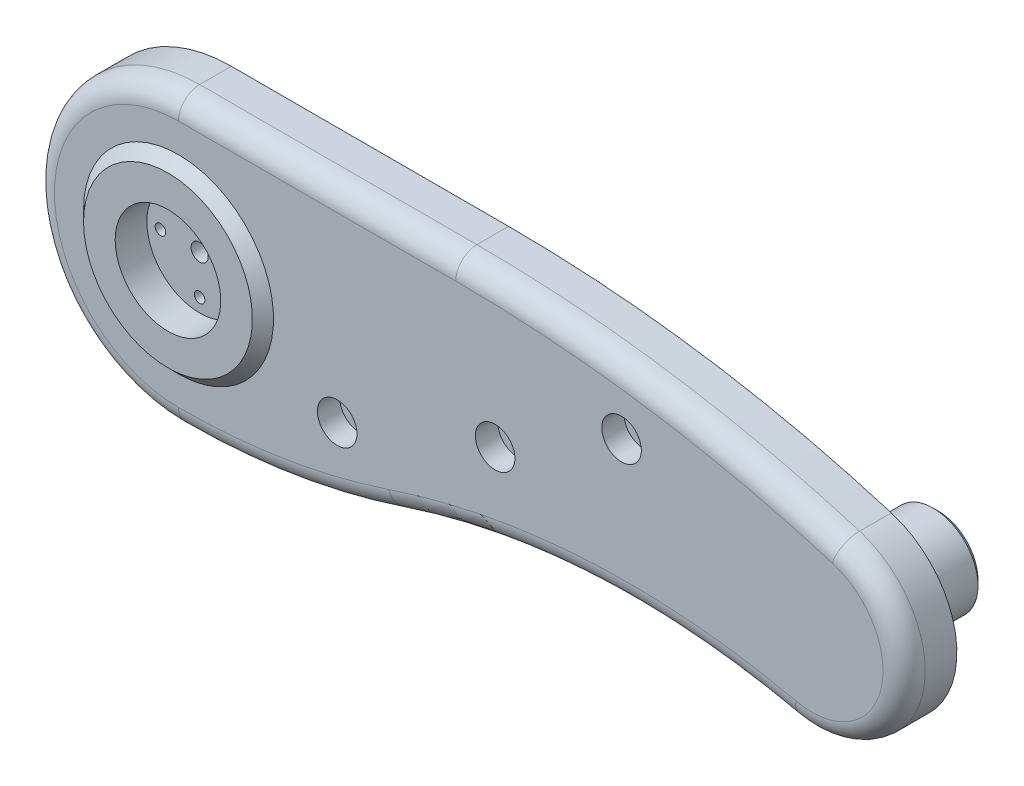
ISO-10303-21;
HEADER;
FILE_DESCRIPTION(('STEP AP214'),'2;1');
FILE_NAME('part.step','',(''),(''),'','','');
FILE_SCHEMA(('AUTOMOTIVE_DESIGN { 1 0 10303 214 1 1 1 1 }'));
ENDSEC;
DATA;
#1=APPLICATION_CONTEXT('core data for automotive mechanical design processes');
#2=APPLICATION_PROTOCOL_DEFINITION('international standard','automotive_design',2000,#1);
#3=PRODUCT_CONTEXT('',#1,'mechanical');
#4=PRODUCT('Part','Part','',(#3));
#5=PRODUCT_RELATED_PRODUCT_CATEGORY('part','',(#4));
#6=PRODUCT_DEFINITION_FORMATION('','',#4);
#7=PRODUCT_DEFINITION_CONTEXT('part definition',#1,'design');
#8=PRODUCT_DEFINITION('design','',#6,#7);
#9=PRODUCT_DEFINITION_SHAPE('','',#8);
#10=(LENGTH_UNIT() NAMED_UNIT(*) SI_UNIT(.MILLI.,.METRE.));
#11=(NAMED_UNIT(*) PLANE_ANGLE_UNIT() SI_UNIT($,.RADIAN.));
#12=(NAMED_UNIT(*) SI_UNIT($,.STERADIAN.) SOLID_ANGLE_UNIT());
#13=UNCERTAINTY_MEASURE_WITH_UNIT(LENGTH_MEASURE(1.E-05),#10,'distance_accuracy_value','');
#14=(GEOMETRIC_REPRESENTATION_CONTEXT(3) GLOBAL_UNCERTAINTY_ASSIGNED_CONTEXT((#13)) GLOBAL_UNIT_ASSIGNED_CONTEXT((#10,
#11,#12)) REPRESENTATION_CONTEXT('',''));
#15=CARTESIAN_POINT('',(0.,0.,0.));
#16=DIRECTION('',(0.,0.,1.));
#17=DIRECTION('',(1.,0.,0.));
#18=AXIS2_PLACEMENT_3D('',#15,#16,#17);
#19=CARTESIAN_POINT('',(0.,0.,4.));
#20=DIRECTION('',(0.,0.,1.));
#21=DIRECTION('',(-1.,0.,0.));
#22=AXIS2_PLACEMENT_3D('',#19,#20,#21);
#23=PLANE('',#22);
#24=CARTESIAN_POINT('',(0.,0.,4.));
#25=DIRECTION('',(0.,0.,-1.));
#26=DIRECTION('',(-1.,0.,0.));
#27=AXIS2_PLACEMENT_3D('',#24,#25,#26);
#28=CIRCLE('',#27,18.);
#29=CARTESIAN_POINT('',(-18.,0.,4.));
#30=VERTEX_POINT('',#29);
#31=EDGE_CURVE('E51',#30,#30,#28,.F.);
#32=ORIENTED_EDGE('',*,*,#31,.F.);
#33=EDGE_LOOP('',(#32));
#34=FACE_BOUND('',#33,.T.);
#35=CARTESIAN_POINT('',(30.0701638651491,-10.9446445864214,4.));
#36=DIRECTION('',(0.,0.,-1.));
#37=DIRECTION('',(-1.,0.,0.));
#38=AXIS2_PLACEMENT_3D('',#35,#36,#37);
#39=CIRCLE('',#38,3.75);
#40=CARTESIAN_POINT('',(26.3201638651491,-10.9446445864214,4.));
#41=VERTEX_POINT('',#40);
#42=EDGE_CURVE('E250',#41,#41,#39,.T.);
#43=ORIENTED_EDGE('',*,*,#42,.T.);
#44=EDGE_LOOP('',(#43));
#45=FACE_BOUND('',#44,.T.);
#46=CARTESIAN_POINT('',(60.,0.,4.));
#47=DIRECTION('',(0.,0.,-1.));
#48=DIRECTION('',(-1.,0.,0.));
#49=AXIS2_PLACEMENT_3D('',#46,#47,#48);
#50=CIRCLE('',#49,3.75000000000001);
#51=CARTESIAN_POINT('',(56.25,0.,4.));
#52=VERTEX_POINT('',#51);
#53=EDGE_CURVE('E254',#52,#52,#50,.T.);
#54=ORIENTED_EDGE('',*,*,#53,.T.);
#55=EDGE_LOOP('',(#54));
#56=FACE_BOUND('',#55,.T.);
#57=CARTESIAN_POINT('',(83.9535089505867,13.2969295284196,4.));
#58=DIRECTION('',(0.,0.,-1.));
#59=DIRECTION('',(-1.,0.,0.));
#60=AXIS2_PLACEMENT_3D('',#57,#58,#59);
#61=CIRCLE('',#60,3.75000000000001);
#62=CARTESIAN_POINT('',(80.2035089505867,13.2969295284196,4.));
#63=VERTEX_POINT('',#62);
#64=EDGE_CURVE('E258',#63,#63,#61,.T.);
#65=ORIENTED_EDGE('',*,*,#64,.T.);
#66=EDGE_LOOP('',(#65));
#67=FACE_BOUND('',#66,.T.);
#68=CARTESIAN_POINT('',(0.,102.5,4.));
#69=DIRECTION('',(0.,0.,-1.));
#70=DIRECTION('',(-1.,0.,0.));
#71=AXIS2_PLACEMENT_3D('',#68,#69,#70);
#72=CIRCLE('',#71,126.);
#73=CARTESIAN_POINT('',(39.8414913927188,-17.0351645483617,4.));
#74=VERTEX_POINT('',#73);
#75=CARTESIAN_POINT('',(0.,-23.5,4.));
#76=VERTEX_POINT('',#75);
#77=EDGE_CURVE('E190',#74,#76,#72,.T.);
#78=ORIENTED_EDGE('',*,*,#77,.F.);
#79=CARTESIAN_POINT('',(85.3746244129688,-153.646781175061,4.));
#80=DIRECTION('',(0.,0.,-1.));
#81=DIRECTION('',(-1.,0.,0.));
#82=AXIS2_PLACEMENT_3D('',#79,#80,#81);
#83=CIRCLE('',#82,144.);
#84=CARTESIAN_POINT('',(117.032110663969,-13.1697241007195,4.));
#85=VERTEX_POINT('',#84);
#86=EDGE_CURVE('E187',#85,#74,#83,.F.);
#87=ORIENTED_EDGE('',*,*,#86,.F.);
#88=CARTESIAN_POINT('',(120.,0.,4.));
#89=DIRECTION('',(0.,0.,-1.));
#90=DIRECTION('',(-1.,0.,0.));
#91=AXIS2_PLACEMENT_3D('',#88,#89,#90);
#92=CIRCLE('',#91,13.5);
#93=CARTESIAN_POINT('',(123.916665744164,12.9193548387097,4.));
#94=VERTEX_POINT('',#93);
#95=EDGE_CURVE('E184',#94,#85,#92,.T.);
#96=ORIENTED_EDGE('',*,*,#95,.F.);
#97=CARTESIAN_POINT('',(52.5463121838399,-222.5,4.));
#98=DIRECTION('',(0.,0.,-1.));
#99=DIRECTION('',(-1.,0.,0.));
#100=AXIS2_PLACEMENT_3D('',#97,#98,#99);
#101=CIRCLE('',#100,246.);
#102=CARTESIAN_POINT('',(52.5463121838399,23.5,4.));
#103=VERTEX_POINT('',#102);
#104=EDGE_CURVE('E182',#103,#94,#101,.T.);
#105=ORIENTED_EDGE('',*,*,#104,.F.);
#106=DIRECTION('',(1.,0.,0.));
#107=VECTOR('',#106,1.);
#108=CARTESIAN_POINT('',(0.,23.5,4.));
#109=LINE('',#108,#107);
#110=CARTESIAN_POINT('',(0.,23.5,4.));
#111=VERTEX_POINT('',#110);
#112=EDGE_CURVE('E127',#111,#103,#109,.T.);
#113=ORIENTED_EDGE('',*,*,#112,.F.);
#114=CARTESIAN_POINT('',(0.,0.,4.));
#115=DIRECTION('',(0.,0.,-1.));
#116=DIRECTION('',(-1.,0.,0.));
#117=AXIS2_PLACEMENT_3D('',#114,#115,#116);
#118=CIRCLE('',#117,23.5);
#119=EDGE_CURVE('E193',#76,#111,#118,.T.);
#120=ORIENTED_EDGE('',*,*,#119,.F.);
#121=EDGE_LOOP('',(#78,#87,#96,#105,#113,#120));
#122=FACE_BOUND('',#121,.T.);
#123=ADVANCED_FACE('F43',(#34,#45,#56,#67,#122),#23,.T.);
#124=CARTESIAN_POINT('',(0.,0.,-20.));
#125=DIRECTION('',(0.,0.,1.));
#126=DIRECTION('',(-1.,0.,0.));
#127=AXIS2_PLACEMENT_3D('',#124,#125,#126);
#128=CYLINDRICAL_SURFACE('',#127,1.625);
#129=CARTESIAN_POINT('',(0.,0.,0.));
#130=DIRECTION('',(0.,0.,-1.));
#131=DIRECTION('',(-1.,0.,0.));
#132=AXIS2_PLACEMENT_3D('',#129,#130,#131);
#133=CIRCLE('',#132,1.625);
#134=CARTESIAN_POINT('',(-1.625,0.,0.));
#135=VERTEX_POINT('',#134);
#136=EDGE_CURVE('E236',#135,#135,#133,.T.);
#137=ORIENTED_EDGE('',*,*,#136,.F.);
#138=EDGE_LOOP('',(#137));
#139=FACE_BOUND('',#138,.T.);
#140=CARTESIAN_POINT('',(0.,0.,-3.));
#141=DIRECTION('',(0.,0.,1.));
#142=DIRECTION('',(1.,0.,0.));
#143=AXIS2_PLACEMENT_3D('',#140,#141,#142);
#144=CIRCLE('',#143,1.625);
#145=CARTESIAN_POINT('',(1.625,0.,-3.));
#146=VERTEX_POINT('',#145);
#147=EDGE_CURVE('E234',#146,#146,#144,.F.);
#148=ORIENTED_EDGE('',*,*,#147,.T.);
#149=EDGE_LOOP('',(#148));
#150=FACE_BOUND('',#149,.T.);
#151=ADVANCED_FACE('F245',(#139,#150),#128,.F.);
#152=CARTESIAN_POINT('',(0.,0.,-6.));
#153=DIRECTION('',(0.,0.,-1.));
#154=DIRECTION('',(1.,0.,0.));
#155=AXIS2_PLACEMENT_3D('',#152,#153,#154);
#156=PLANE('',#155);
#157=CARTESIAN_POINT('',(0.,0.,-6.));
#158=DIRECTION('',(0.,0.,1.));
#159=DIRECTION('',(1.,0.,0.));
#160=AXIS2_PLACEMENT_3D('',#157,#158,#159);
#161=CIRCLE('',#160,9.5);
#162=CARTESIAN_POINT('',(9.5,0.,-6.));
#163=VERTEX_POINT('',#162);
#164=EDGE_CURVE('E377',#163,#163,#161,.T.);
#165=ORIENTED_EDGE('',*,*,#164,.T.);
#166=EDGE_LOOP('',(#165));
#167=FACE_BOUND('',#166,.T.);
#168=CARTESIAN_POINT('',(83.9535089505867,13.2969295284196,-6.));
#169=DIRECTION('',(0.,0.,1.));
#170=DIRECTION('',(1.,0.,0.));
#171=AXIS2_PLACEMENT_3D('',#168,#169,#170);
#172=CIRCLE('',#171,2.125);
#173=CARTESIAN_POINT('',(86.0785089505867,13.2969295284196,-6.));
#174=VERTEX_POINT('',#173);
#175=EDGE_CURVE('E147',#174,#174,#172,.T.);
#176=ORIENTED_EDGE('',*,*,#175,.T.);
#177=EDGE_LOOP('',(#176));
#178=FACE_BOUND('',#177,.T.);
#179=CARTESIAN_POINT('',(60.,0.,-6.));
#180=DIRECTION('',(0.,0.,1.));
#181=DIRECTION('',(1.,0.,0.));
#182=AXIS2_PLACEMENT_3D('',#179,#180,#181);
#183=CIRCLE('',#182,2.125);
#184=CARTESIAN_POINT('',(62.125,0.,-6.));
#185=VERTEX_POINT('',#184);
#186=EDGE_CURVE('E384',#185,#185,#183,.T.);
#187=ORIENTED_EDGE('',*,*,#186,.T.);
#188=EDGE_LOOP('',(#187));
#189=FACE_BOUND('',#188,.T.);
#190=CARTESIAN_POINT('',(30.0701638651491,-10.9446445864214,-6.));
#191=DIRECTION('',(0.,0.,1.));
#192=DIRECTION('',(1.,0.,0.));
#193=AXIS2_PLACEMENT_3D('',#190,#191,#192);
#194=CIRCLE('',#193,2.125);
#195=CARTESIAN_POINT('',(32.1951638651491,-10.9446445864214,-6.));
#196=VERTEX_POINT('',#195);
#197=EDGE_CURVE('E180',#196,#196,#194,.T.);
#198=ORIENTED_EDGE('',*,*,#197,.T.);
#199=EDGE_LOOP('',(#198));
#200=FACE_BOUND('',#199,.T.);
#201=DIRECTION('',(1.,0.,0.));
#202=VECTOR('',#201,1.);
#203=CARTESIAN_POINT('',(0.,27.5,-6.));
#204=LINE('',#203,#202);
#205=CARTESIAN_POINT('',(0.,27.5,-6.));
#206=VERTEX_POINT('',#205);
#207=CARTESIAN_POINT('',(52.5463121838399,27.5,-6.));
#208=VERTEX_POINT('',#207);
#209=EDGE_CURVE('E135',#206,#208,#204,.T.);
#210=ORIENTED_EDGE('',*,*,#209,.T.);
#211=CARTESIAN_POINT('',(52.5463121838399,-222.5,-6.));
#212=DIRECTION('',(0.,0.,1.));
#213=DIRECTION('',(1.,0.,0.));
#214=AXIS2_PLACEMENT_3D('',#211,#212,#213);
#215=CIRCLE('',#214,250.);
#216=CARTESIAN_POINT('',(125.077159297991,16.747311827957,-6.));
#217=VERTEX_POINT('',#216);
#218=EDGE_CURVE('E157',#208,#217,#215,.F.);
#219=ORIENTED_EDGE('',*,*,#218,.T.);
#220=CARTESIAN_POINT('',(120.,0.,-6.));
#221=DIRECTION('',(0.,0.,1.));
#222=DIRECTION('',(1.,0.,0.));
#223=AXIS2_PLACEMENT_3D('',#220,#221,#222);
#224=CIRCLE('',#223,17.5);
#225=CARTESIAN_POINT('',(116.152736045885,-17.0718645750068,-6.));
#226=VERTEX_POINT('',#225);
#227=EDGE_CURVE('E154',#226,#217,#224,.T.);
#228=ORIENTED_EDGE('',*,*,#227,.F.);
#229=CARTESIAN_POINT('',(85.3746244129688,-153.646781175061,-6.));
#230=DIRECTION('',(0.,0.,1.));
#231=DIRECTION('',(1.,0.,0.));
#232=AXIS2_PLACEMENT_3D('',#229,#230,#231);
#233=CIRCLE('',#232,140.);
#234=CARTESIAN_POINT('',(41.1063006432813,-20.8299316768811,-6.));
#235=VERTEX_POINT('',#234);
#236=EDGE_CURVE('E152',#226,#235,#233,.T.);
#237=ORIENTED_EDGE('',*,*,#236,.T.);
#238=CARTESIAN_POINT('',(0.,102.5,-6.));
#239=DIRECTION('',(0.,0.,1.));
#240=DIRECTION('',(1.,0.,0.));
#241=AXIS2_PLACEMENT_3D('',#238,#239,#240);
#242=CIRCLE('',#241,130.);
#243=CARTESIAN_POINT('',(0.,-27.5,-6.));
#244=VERTEX_POINT('',#243);
#245=EDGE_CURVE('E138',#244,#235,#242,.T.);
#246=ORIENTED_EDGE('',*,*,#245,.F.);
#247=CARTESIAN_POINT('',(0.,0.,-6.));
#248=DIRECTION('',(0.,0.,1.));
#249=DIRECTION('',(1.,0.,0.));
#250=AXIS2_PLACEMENT_3D('',#247,#248,#249);
#251=CIRCLE('',#250,27.5);
#252=EDGE_CURVE('E120',#206,#244,#251,.T.);
#253=ORIENTED_EDGE('',*,*,#252,.F.);
#254=EDGE_LOOP('',(#210,#219,#228,#237,#246,#253));
#255=FACE_BOUND('',#254,.T.);
#256=CARTESIAN_POINT('',(120.,0.,-6.));
#257=DIRECTION('',(0.,0.,1.));
#258=DIRECTION('',(1.,0.,0.));
#259=AXIS2_PLACEMENT_3D('',#256,#257,#258);
#260=CIRCLE('',#259,9.50000000000001);
#261=CARTESIAN_POINT('',(129.5,0.,-6.));
#262=VERTEX_POINT('',#261);
#263=EDGE_CURVE('E409',#262,#262,#260,.T.);
#264=ORIENTED_EDGE('',*,*,#263,.T.);
#265=EDGE_LOOP('',(#264));
#266=FACE_BOUND('',#265,.T.);
#267=ADVANCED_FACE('F132',(#167,#178,#189,#200,#255,#266),#156,.T.);
#268=CARTESIAN_POINT('',(30.0701638651491,-10.9446445864214,-20.));
#269=DIRECTION('',(0.,0.,1.));
#270=DIRECTION('',(-1.,0.,0.));
#271=AXIS2_PLACEMENT_3D('',#268,#269,#270);
#272=CYLINDRICAL_SURFACE('',#271,2.125);
#273=ORIENTED_EDGE('',*,*,#197,.F.);
#274=EDGE_LOOP('',(#273));
#275=FACE_BOUND('',#274,.T.);
#276=CARTESIAN_POINT('',(30.0701638651491,-10.9446445864214,-0.25));
#277=DIRECTION('',(0.,0.,-1.));
#278=DIRECTION('',(-1.,0.,0.));
#279=AXIS2_PLACEMENT_3D('',#276,#277,#278);
#280=CIRCLE('',#279,2.125);
#281=CARTESIAN_POINT('',(27.9451638651491,-10.9446445864214,-0.25));
#282=VERTEX_POINT('',#281);
#283=EDGE_CURVE('E177',#282,#282,#280,.F.);
#284=ORIENTED_EDGE('',*,*,#283,.T.);
#285=EDGE_LOOP('',(#284));
#286=FACE_BOUND('',#285,.T.);
#287=ADVANCED_FACE('F363',(#275,#286),#272,.F.);
#288=CARTESIAN_POINT('',(60.,0.,-20.));
#289=DIRECTION('',(0.,0.,1.));
#290=DIRECTION('',(-1.,0.,0.));
#291=AXIS2_PLACEMENT_3D('',#288,#289,#290);
#292=CYLINDRICAL_SURFACE('',#291,2.125);
#293=ORIENTED_EDGE('',*,*,#186,.F.);
#294=EDGE_LOOP('',(#293));
#295=FACE_BOUND('',#294,.T.);
#296=CARTESIAN_POINT('',(60.,0.,-0.25));
#297=DIRECTION('',(0.,0.,-1.));
#298=DIRECTION('',(-1.,0.,0.));
#299=AXIS2_PLACEMENT_3D('',#296,#297,#298);
#300=CIRCLE('',#299,2.125);
#301=CARTESIAN_POINT('',(57.875,0.,-0.25));
#302=VERTEX_POINT('',#301);
#303=EDGE_CURVE('E173',#302,#302,#300,.F.);
#304=ORIENTED_EDGE('',*,*,#303,.T.);
#305=EDGE_LOOP('',(#304));
#306=FACE_BOUND('',#305,.T.);
#307=ADVANCED_FACE('F369',(#295,#306),#292,.F.);
#308=CARTESIAN_POINT('',(83.9535089505867,13.2969295284196,-20.));
#309=DIRECTION('',(0.,0.,1.));
#310=DIRECTION('',(-1.,0.,0.));
#311=AXIS2_PLACEMENT_3D('',#308,#309,#310);
#312=CYLINDRICAL_SURFACE('',#311,2.125);
#313=ORIENTED_EDGE('',*,*,#175,.F.);
#314=EDGE_LOOP('',(#313));
#315=FACE_BOUND('',#314,.T.);
#316=CARTESIAN_POINT('',(83.9535089505867,13.2969295284196,-0.25));
#317=DIRECTION('',(0.,0.,-1.));
#318=DIRECTION('',(-1.,0.,0.));
#319=AXIS2_PLACEMENT_3D('',#316,#317,#318);
#320=CIRCLE('',#319,2.125);
#321=CARTESIAN_POINT('',(81.8285089505867,13.2969295284196,-0.25));
#322=VERTEX_POINT('',#321);
#323=EDGE_CURVE('E170',#322,#322,#320,.F.);
#324=ORIENTED_EDGE('',*,*,#323,.T.);
#325=EDGE_LOOP('',(#324));
#326=FACE_BOUND('',#325,.T.);
#327=ADVANCED_FACE('F310',(#315,#326),#312,.F.);
#328=CARTESIAN_POINT('',(0.,27.5,-6.));
#329=DIRECTION('',(0.,1.,0.));
#330=DIRECTION('',(0.,0.,-1.));
#331=AXIS2_PLACEMENT_3D('',#328,#329,#330);
#332=PLANE('',#331);
#333=DIRECTION('',(0.,0.,1.));
#334=VECTOR('',#333,1.);
#335=CARTESIAN_POINT('',(52.5463121838399,27.5,-6.));
#336=LINE('',#335,#334);
#337=CARTESIAN_POINT('',(52.5463121838399,27.5,0.));
#338=VERTEX_POINT('',#337);
#339=EDGE_CURVE('E142',#208,#338,#336,.T.);
#340=ORIENTED_EDGE('',*,*,#339,.F.);
#341=ORIENTED_EDGE('',*,*,#209,.F.);
#342=DIRECTION('',(0.,0.,1.));
#343=VECTOR('',#342,1.);
#344=CARTESIAN_POINT('',(0.,27.5,-6.));
#345=LINE('',#344,#343);
#346=CARTESIAN_POINT('',(0.,27.5,0.));
#347=VERTEX_POINT('',#346);
#348=EDGE_CURVE('E116',#206,#347,#345,.T.);
#349=ORIENTED_EDGE('',*,*,#348,.T.);
#350=DIRECTION('',(1.,0.,0.));
#351=VECTOR('',#350,1.);
#352=CARTESIAN_POINT('',(0.,27.5,0.));
#353=LINE('',#352,#351);
#354=EDGE_CURVE('E208',#338,#347,#353,.F.);
#355=ORIENTED_EDGE('',*,*,#354,.F.);
#356=EDGE_LOOP('',(#340,#341,#349,#355));
#357=FACE_BOUND('',#356,.T.);
#358=ADVANCED_FACE('F140',(#357),#332,.T.);
#359=CARTESIAN_POINT('',(0.,0.,-6.));
#360=DIRECTION('',(0.,0.,1.));
#361=DIRECTION('',(-1.,0.,0.));
#362=AXIS2_PLACEMENT_3D('',#359,#360,#361);
#363=CYLINDRICAL_SURFACE('',#362,27.5);
#364=ORIENTED_EDGE('',*,*,#348,.F.);
#365=ORIENTED_EDGE('',*,*,#252,.T.);
#366=DIRECTION('',(0.,0.,1.));
#367=VECTOR('',#366,1.);
#368=CARTESIAN_POINT('',(0.,-27.5,-6.));
#369=LINE('',#368,#367);
#370=CARTESIAN_POINT('',(0.,-27.5,0.));
#371=VERTEX_POINT('',#370);
#372=EDGE_CURVE('E128',#244,#371,#369,.T.);
#373=ORIENTED_EDGE('',*,*,#372,.T.);
#374=CARTESIAN_POINT('',(0.,0.,0.));
#375=DIRECTION('',(0.,0.,-1.));
#376=DIRECTION('',(-1.,0.,0.));
#377=AXIS2_PLACEMENT_3D('',#374,#375,#376);
#378=CIRCLE('',#377,27.5);
#379=EDGE_CURVE('E123',#347,#371,#378,.F.);
#380=ORIENTED_EDGE('',*,*,#379,.F.);
#381=EDGE_LOOP('',(#364,#365,#373,#380));
#382=FACE_BOUND('',#381,.T.);
#383=ADVANCED_FACE('F118',(#382),#363,.T.);
#384=CARTESIAN_POINT('',(0.,102.5,-6.));
#385=DIRECTION('',(0.,0.,1.));
#386=DIRECTION('',(-1.,0.,0.));
#387=AXIS2_PLACEMENT_3D('',#384,#385,#386);
#388=CYLINDRICAL_SURFACE('',#387,130.);
#389=ORIENTED_EDGE('',*,*,#372,.F.);
#390=ORIENTED_EDGE('',*,*,#245,.T.);
#391=DIRECTION('',(0.,0.,1.));
#392=VECTOR('',#391,1.);
#393=CARTESIAN_POINT('',(41.1063006432813,-20.8299316768811,-6.));
#394=LINE('',#393,#392);
#395=CARTESIAN_POINT('',(41.1063006432813,-20.8299316768811,0.));
#396=VERTEX_POINT('',#395);
#397=EDGE_CURVE('E166',#235,#396,#394,.T.);
#398=ORIENTED_EDGE('',*,*,#397,.T.);
#399=CARTESIAN_POINT('',(0.,102.5,0.));
#400=DIRECTION('',(0.,0.,-1.));
#401=DIRECTION('',(-1.,0.,0.));
#402=AXIS2_PLACEMENT_3D('',#399,#400,#401);
#403=CIRCLE('',#402,130.);
#404=EDGE_CURVE('E197',#371,#396,#403,.F.);
#405=ORIENTED_EDGE('',*,*,#404,.F.);
#406=EDGE_LOOP('',(#389,#390,#398,#405));
#407=FACE_BOUND('',#406,.T.);
#408=ADVANCED_FACE('F279',(#407),#388,.T.);
#409=CARTESIAN_POINT('',(85.3746244129688,-153.646781175061,-6.));
#410=DIRECTION('',(0.,0.,1.));
#411=DIRECTION('',(-1.,0.,0.));
#412=AXIS2_PLACEMENT_3D('',#409,#410,#411);
#413=CYLINDRICAL_SURFACE('',#412,140.);
#414=ORIENTED_EDGE('',*,*,#397,.F.);
#415=ORIENTED_EDGE('',*,*,#236,.F.);
#416=DIRECTION('',(0.,0.,1.));
#417=VECTOR('',#416,1.);
#418=CARTESIAN_POINT('',(116.152736045885,-17.0718645750068,-6.));
#419=LINE('',#418,#417);
#420=CARTESIAN_POINT('',(116.152736045885,-17.0718645750068,0.));
#421=VERTEX_POINT('',#420);
#422=EDGE_CURVE('E163',#226,#421,#419,.T.);
#423=ORIENTED_EDGE('',*,*,#422,.T.);
#424=CARTESIAN_POINT('',(85.3746244129688,-153.646781175061,0.));
#425=DIRECTION('',(0.,0.,-1.));
#426=DIRECTION('',(-1.,0.,0.));
#427=AXIS2_PLACEMENT_3D('',#424,#425,#426);
#428=CIRCLE('',#427,140.);
#429=EDGE_CURVE('E200',#396,#421,#428,.T.);
#430=ORIENTED_EDGE('',*,*,#429,.F.);
#431=EDGE_LOOP('',(#414,#415,#423,#430));
#432=FACE_BOUND('',#431,.T.);
#433=ADVANCED_FACE('F282',(#432),#413,.F.);
#434=CARTESIAN_POINT('',(120.,0.,-6.));
#435=DIRECTION('',(0.,0.,1.));
#436=DIRECTION('',(-1.,0.,0.));
#437=AXIS2_PLACEMENT_3D('',#434,#435,#436);
#438=CYLINDRICAL_SURFACE('',#437,17.5);
#439=ORIENTED_EDGE('',*,*,#422,.F.);
#440=ORIENTED_EDGE('',*,*,#227,.T.);
#441=DIRECTION('',(0.,0.,1.));
#442=VECTOR('',#441,1.);
#443=CARTESIAN_POINT('',(125.077159297991,16.747311827957,-6.));
#444=LINE('',#443,#442);
#445=CARTESIAN_POINT('',(125.077159297991,16.747311827957,0.));
#446=VERTEX_POINT('',#445);
#447=EDGE_CURVE('E160',#217,#446,#444,.T.);
#448=ORIENTED_EDGE('',*,*,#447,.T.);
#449=CARTESIAN_POINT('',(120.,0.,0.));
#450=DIRECTION('',(0.,0.,-1.));
#451=DIRECTION('',(-1.,0.,0.));
#452=AXIS2_PLACEMENT_3D('',#449,#450,#451);
#453=CIRCLE('',#452,17.5);
#454=EDGE_CURVE('E203',#421,#446,#453,.F.);
#455=ORIENTED_EDGE('',*,*,#454,.F.);
#456=EDGE_LOOP('',(#439,#440,#448,#455));
#457=FACE_BOUND('',#456,.T.);
#458=ADVANCED_FACE('F285',(#457),#438,.T.);
#459=CARTESIAN_POINT('',(52.5463121838399,-222.5,-6.));
#460=DIRECTION('',(0.,0.,1.));
#461=DIRECTION('',(-1.,0.,0.));
#462=AXIS2_PLACEMENT_3D('',#459,#460,#461);
#463=CYLINDRICAL_SURFACE('',#462,250.);
#464=ORIENTED_EDGE('',*,*,#447,.F.);
#465=ORIENTED_EDGE('',*,*,#218,.F.);
#466=ORIENTED_EDGE('',*,*,#339,.T.);
#467=CARTESIAN_POINT('',(52.5463121838399,-222.5,0.));
#468=DIRECTION('',(0.,0.,-1.));
#469=DIRECTION('',(-1.,0.,0.));
#470=AXIS2_PLACEMENT_3D('',#467,#468,#469);
#471=CIRCLE('',#470,250.);
#472=EDGE_CURVE('E206',#446,#338,#471,.F.);
#473=ORIENTED_EDGE('',*,*,#472,.F.);
#474=EDGE_LOOP('',(#464,#465,#466,#473));
#475=FACE_BOUND('',#474,.T.);
#476=ADVANCED_FACE('F287',(#475),#463,.T.);
#477=CARTESIAN_POINT('',(0.,0.,4.));
#478=DIRECTION('',(0.,0.,-1.));
#479=DIRECTION('',(1.,0.,0.));
#480=AXIS2_PLACEMENT_3D('',#477,#478,#479);
#481=CYLINDRICAL_SURFACE('',#480,10.);
#482=CARTESIAN_POINT('',(0.,0.,0.));
#483=DIRECTION('',(0.,0.,-1.));
#484=DIRECTION('',(-1.,0.,0.));
#485=AXIS2_PLACEMENT_3D('',#482,#483,#484);
#486=CIRCLE('',#485,10.);
#487=CARTESIAN_POINT('',(-10.,0.,0.));
#488=VERTEX_POINT('',#487);
#489=EDGE_CURVE('E144',#488,#488,#486,.T.);
#490=ORIENTED_EDGE('',*,*,#489,.T.);
#491=EDGE_LOOP('',(#490));
#492=FACE_BOUND('',#491,.T.);
#493=CARTESIAN_POINT('',(0.,0.,6.));
#494=DIRECTION('',(0.,0.,-1.));
#495=DIRECTION('',(-1.,0.,0.));
#496=AXIS2_PLACEMENT_3D('',#493,#494,#495);
#497=CIRCLE('',#496,10.);
#498=CARTESIAN_POINT('',(-10.,0.,6.));
#499=VERTEX_POINT('',#498);
#500=EDGE_CURVE('E426',#499,#499,#497,.T.);
#501=ORIENTED_EDGE('',*,*,#500,.F.);
#502=EDGE_LOOP('',(#501));
#503=FACE_BOUND('',#502,.T.);
#504=ADVANCED_FACE('F289',(#492,#503),#481,.F.);
#505=CARTESIAN_POINT('',(0.,0.,0.));
#506=DIRECTION('',(0.,0.,-1.));
#507=DIRECTION('',(1.,0.,0.));
#508=AXIS2_PLACEMENT_3D('',#505,#506,#507);
#509=PLANE('',#508);
#510=CARTESIAN_POINT('',(0.,7.42,0.));
#511=DIRECTION('',(0.,0.,-1.));
#512=DIRECTION('',(-1.,0.,0.));
#513=AXIS2_PLACEMENT_3D('',#510,#511,#512);
#514=CIRCLE('',#513,1.);
#515=CARTESIAN_POINT('',(-1.,7.42,0.));
#516=VERTEX_POINT('',#515);
#517=EDGE_CURVE('E441',#516,#516,#514,.T.);
#518=ORIENTED_EDGE('',*,*,#517,.T.);
#519=EDGE_LOOP('',(#518));
#520=FACE_BOUND('',#519,.T.);
#521=CARTESIAN_POINT('',(-7.42,0.,0.));
#522=DIRECTION('',(0.,0.,-1.));
#523=DIRECTION('',(-1.,0.,0.));
#524=AXIS2_PLACEMENT_3D('',#521,#522,#523);
#525=CIRCLE('',#524,1.00000000000001);
#526=CARTESIAN_POINT('',(-8.42000000000001,0.,0.));
#527=VERTEX_POINT('',#526);
#528=EDGE_CURVE('E438',#527,#527,#525,.T.);
#529=ORIENTED_EDGE('',*,*,#528,.T.);
#530=EDGE_LOOP('',(#529));
#531=FACE_BOUND('',#530,.T.);
#532=CARTESIAN_POINT('',(0.,-7.42,0.));
#533=DIRECTION('',(0.,0.,-1.));
#534=DIRECTION('',(-1.,0.,0.));
#535=AXIS2_PLACEMENT_3D('',#532,#533,#534);
#536=CIRCLE('',#535,1.);
#537=CARTESIAN_POINT('',(-1.,-7.42,0.));
#538=VERTEX_POINT('',#537);
#539=EDGE_CURVE('E432',#538,#538,#536,.T.);
#540=ORIENTED_EDGE('',*,*,#539,.T.);
#541=EDGE_LOOP('',(#540));
#542=FACE_BOUND('',#541,.T.);
#543=CARTESIAN_POINT('',(7.42,0.,0.));
#544=DIRECTION('',(0.,0.,-1.));
#545=DIRECTION('',(-1.,0.,0.));
#546=AXIS2_PLACEMENT_3D('',#543,#544,#545);
#547=CIRCLE('',#546,1.);
#548=CARTESIAN_POINT('',(6.42,0.,0.));
#549=VERTEX_POINT('',#548);
#550=EDGE_CURVE('E425',#549,#549,#547,.T.);
#551=ORIENTED_EDGE('',*,*,#550,.T.);
#552=EDGE_LOOP('',(#551));
#553=FACE_BOUND('',#552,.T.);
#554=ORIENTED_EDGE('',*,*,#136,.T.);
#555=EDGE_LOOP('',(#554));
#556=FACE_BOUND('',#555,.T.);
#557=ORIENTED_EDGE('',*,*,#489,.F.);
#558=EDGE_LOOP('',(#557));
#559=FACE_BOUND('',#558,.T.);
#560=ADVANCED_FACE('F295',(#520,#531,#542,#553,#556,#559),#509,.F.);
#561=CARTESIAN_POINT('',(83.9535089505867,13.2969295284196,-0.25));
#562=DIRECTION('',(0.,0.,1.));
#563=DIRECTION('',(-1.,0.,0.));
#564=AXIS2_PLACEMENT_3D('',#561,#562,#563);
#565=PLANE('',#564);
#566=CARTESIAN_POINT('',(83.9535089505867,13.2969295284196,-0.25));
#567=DIRECTION('',(0.,0.,-1.));
#568=DIRECTION('',(-1.,0.,0.));
#569=AXIS2_PLACEMENT_3D('',#566,#567,#568);
#570=CIRCLE('',#569,3.75000000000001);
#571=CARTESIAN_POINT('',(80.2035089505867,13.2969295284196,-0.25));
#572=VERTEX_POINT('',#571);
#573=EDGE_CURVE('E174',#572,#572,#570,.T.);
#574=ORIENTED_EDGE('',*,*,#573,.F.);
#575=EDGE_LOOP('',(#574));
#576=FACE_BOUND('',#575,.T.);
#577=ORIENTED_EDGE('',*,*,#323,.F.);
#578=EDGE_LOOP('',(#577));
#579=FACE_BOUND('',#578,.T.);
#580=ADVANCED_FACE('F504',(#576,#579),#565,.T.);
#581=CARTESIAN_POINT('',(83.9535089505867,13.2969295284196,-0.25));
#582=DIRECTION('',(0.,0.,1.));
#583=DIRECTION('',(-1.,0.,0.));
#584=AXIS2_PLACEMENT_3D('',#581,#582,#583);
#585=CYLINDRICAL_SURFACE('',#584,3.75000000000001);
#586=ORIENTED_EDGE('',*,*,#573,.T.);
#587=EDGE_LOOP('',(#586));
#588=FACE_BOUND('',#587,.T.);
#589=ORIENTED_EDGE('',*,*,#64,.F.);
#590=EDGE_LOOP('',(#589));
#591=FACE_BOUND('',#590,.T.);
#592=ADVANCED_FACE('F507',(#588,#591),#585,.F.);
#593=CARTESIAN_POINT('',(60.,0.,-0.25));
#594=DIRECTION('',(0.,0.,1.));
#595=DIRECTION('',(-1.,0.,0.));
#596=AXIS2_PLACEMENT_3D('',#593,#594,#595);
#597=PLANE('',#596);
#598=CARTESIAN_POINT('',(60.,0.,-0.25));
#599=DIRECTION('',(0.,0.,-1.));
#600=DIRECTION('',(-1.,0.,0.));
#601=AXIS2_PLACEMENT_3D('',#598,#599,#600);
#602=CIRCLE('',#601,3.75000000000001);
#603=CARTESIAN_POINT('',(56.25,0.,-0.25));
#604=VERTEX_POINT('',#603);
#605=EDGE_CURVE('E393',#604,#604,#602,.T.);
#606=ORIENTED_EDGE('',*,*,#605,.F.);
#607=EDGE_LOOP('',(#606));
#608=FACE_BOUND('',#607,.T.);
#609=ORIENTED_EDGE('',*,*,#303,.F.);
#610=EDGE_LOOP('',(#609));
#611=FACE_BOUND('',#610,.T.);
#612=ADVANCED_FACE('F511',(#608,#611),#597,.T.);
#613=CARTESIAN_POINT('',(60.,0.,-0.25));
#614=DIRECTION('',(0.,0.,1.));
#615=DIRECTION('',(-1.,0.,0.));
#616=AXIS2_PLACEMENT_3D('',#613,#614,#615);
#617=CYLINDRICAL_SURFACE('',#616,3.75000000000001);
#618=ORIENTED_EDGE('',*,*,#605,.T.);
#619=EDGE_LOOP('',(#618));
#620=FACE_BOUND('',#619,.T.);
#621=ORIENTED_EDGE('',*,*,#53,.F.);
#622=EDGE_LOOP('',(#621));
#623=FACE_BOUND('',#622,.T.);
#624=ADVANCED_FACE('F513',(#620,#623),#617,.F.);
#625=CARTESIAN_POINT('',(30.0701638651491,-10.9446445864214,-0.25));
#626=DIRECTION('',(0.,0.,1.));
#627=DIRECTION('',(-1.,0.,0.));
#628=AXIS2_PLACEMENT_3D('',#625,#626,#627);
#629=PLANE('',#628);
#630=CARTESIAN_POINT('',(30.0701638651491,-10.9446445864214,-0.25));
#631=DIRECTION('',(0.,0.,-1.));
#632=DIRECTION('',(-1.,0.,0.));
#633=AXIS2_PLACEMENT_3D('',#630,#631,#632);
#634=CIRCLE('',#633,3.75);
#635=CARTESIAN_POINT('',(26.3201638651491,-10.9446445864214,-0.25));
#636=VERTEX_POINT('',#635);
#637=EDGE_CURVE('E222',#636,#636,#634,.T.);
#638=ORIENTED_EDGE('',*,*,#637,.F.);
#639=EDGE_LOOP('',(#638));
#640=FACE_BOUND('',#639,.T.);
#641=ORIENTED_EDGE('',*,*,#283,.F.);
#642=EDGE_LOOP('',(#641));
#643=FACE_BOUND('',#642,.T.);
#644=ADVANCED_FACE('F516',(#640,#643),#629,.T.);
#645=CARTESIAN_POINT('',(30.0701638651491,-10.9446445864214,-0.25));
#646=DIRECTION('',(0.,0.,1.));
#647=DIRECTION('',(-1.,0.,0.));
#648=AXIS2_PLACEMENT_3D('',#645,#646,#647);
#649=CYLINDRICAL_SURFACE('',#648,3.75);
#650=ORIENTED_EDGE('',*,*,#637,.T.);
#651=EDGE_LOOP('',(#650));
#652=FACE_BOUND('',#651,.T.);
#653=ORIENTED_EDGE('',*,*,#42,.F.);
#654=EDGE_LOOP('',(#653));
#655=FACE_BOUND('',#654,.T.);
#656=ADVANCED_FACE('F324',(#652,#655),#649,.F.);
#657=CARTESIAN_POINT('',(120.,0.,0.));
#658=DIRECTION('',(0.,0.,1.));
#659=DIRECTION('',(-1.,0.,0.));
#660=AXIS2_PLACEMENT_3D('',#657,#658,#659);
#661=TOROIDAL_SURFACE('',#660,13.5,4.);
#662=CARTESIAN_POINT('',(123.916665744164,12.9193548387097,0.));
#663=DIRECTION('',(0.956989247311828,-0.290123388456603,0.));
#664=DIRECTION('',(-0.290123388456603,-0.956989247311828,0.));
#665=AXIS2_PLACEMENT_3D('',#662,#663,#664);
#666=CIRCLE('',#665,4.);
#667=EDGE_CURVE('E65',#446,#94,#666,.T.);
#668=ORIENTED_EDGE('',*,*,#667,.T.);
#669=ORIENTED_EDGE('',*,*,#95,.T.);
#670=CARTESIAN_POINT('',(117.032110663969,-13.1697241007195,0.));
#671=DIRECTION('',(0.975535118571815,-0.219843654520834,0.));
#672=DIRECTION('',(-0.219843654520834,-0.975535118571815,0.));
#673=AXIS2_PLACEMENT_3D('',#670,#671,#672);
#674=CIRCLE('',#673,4.);
#675=EDGE_CURVE('E220',#85,#421,#674,.T.);
#676=ORIENTED_EDGE('',*,*,#675,.T.);
#677=ORIENTED_EDGE('',*,*,#454,.T.);
#678=EDGE_LOOP('',(#668,#669,#676,#677));
#679=FACE_BOUND('',#678,.T.);
#680=ADVANCED_FACE('F272',(#679),#661,.T.);
#681=CARTESIAN_POINT('',(85.3746244129688,-153.646781175061,0.));
#682=DIRECTION('',(0.,0.,1.));
#683=DIRECTION('',(-1.,0.,0.));
#684=AXIS2_PLACEMENT_3D('',#681,#682,#683);
#685=TOROIDAL_SURFACE('',#684,144.,4.);
#686=ORIENTED_EDGE('',*,*,#675,.F.);
#687=ORIENTED_EDGE('',*,*,#86,.T.);
#688=CARTESIAN_POINT('',(39.8414913927188,-17.0351645483617,0.));
#689=DIRECTION('',(0.948691782129855,0.316202312640625,0.));
#690=DIRECTION('',(0.316202312640625,-0.948691782129855,0.));
#691=AXIS2_PLACEMENT_3D('',#688,#689,#690);
#692=CIRCLE('',#691,4.);
#693=EDGE_CURVE('E217',#74,#396,#692,.T.);
#694=ORIENTED_EDGE('',*,*,#693,.T.);
#695=ORIENTED_EDGE('',*,*,#429,.T.);
#696=EDGE_LOOP('',(#686,#687,#694,#695));
#697=FACE_BOUND('',#696,.T.);
#698=ADVANCED_FACE('F269',(#697),#685,.T.);
#699=CARTESIAN_POINT('',(52.5463121838399,-222.5,0.));
#700=DIRECTION('',(0.,0.,1.));
#701=DIRECTION('',(-1.,0.,0.));
#702=AXIS2_PLACEMENT_3D('',#699,#700,#701);
#703=TOROIDAL_SURFACE('',#702,246.,4.);
#704=ORIENTED_EDGE('',*,*,#667,.F.);
#705=ORIENTED_EDGE('',*,*,#472,.T.);
#706=CARTESIAN_POINT('',(52.5463121838399,23.5,0.));
#707=DIRECTION('',(1.,0.,0.));
#708=DIRECTION('',(0.,0.,-1.));
#709=AXIS2_PLACEMENT_3D('',#706,#707,#708);
#710=CIRCLE('',#709,4.);
#711=EDGE_CURVE('E58',#338,#103,#710,.T.);
#712=ORIENTED_EDGE('',*,*,#711,.T.);
#713=ORIENTED_EDGE('',*,*,#104,.T.);
#714=EDGE_LOOP('',(#704,#705,#712,#713));
#715=FACE_BOUND('',#714,.T.);
#716=ADVANCED_FACE('F274',(#715),#703,.T.);
#717=CARTESIAN_POINT('',(0.,102.5,0.));
#718=DIRECTION('',(0.,0.,1.));
#719=DIRECTION('',(-1.,0.,0.));
#720=AXIS2_PLACEMENT_3D('',#717,#718,#719);
#721=TOROIDAL_SURFACE('',#720,126.,4.);
#722=ORIENTED_EDGE('',*,*,#693,.F.);
#723=ORIENTED_EDGE('',*,*,#77,.T.);
#724=CARTESIAN_POINT('',(0.,-23.5,0.));
#725=DIRECTION('',(1.,0.,0.));
#726=DIRECTION('',(0.,0.,-1.));
#727=AXIS2_PLACEMENT_3D('',#724,#725,#726);
#728=CIRCLE('',#727,4.);
#729=EDGE_CURVE('E213',#76,#371,#728,.T.);
#730=ORIENTED_EDGE('',*,*,#729,.T.);
#731=ORIENTED_EDGE('',*,*,#404,.T.);
#732=EDGE_LOOP('',(#722,#723,#730,#731));
#733=FACE_BOUND('',#732,.T.);
#734=ADVANCED_FACE('F265',(#733),#721,.T.);
#735=CARTESIAN_POINT('',(0.,23.5,0.));
#736=DIRECTION('',(1.,0.,0.));
#737=DIRECTION('',(0.,0.,1.));
#738=AXIS2_PLACEMENT_3D('',#735,#736,#737);
#739=CYLINDRICAL_SURFACE('',#738,4.);
#740=ORIENTED_EDGE('',*,*,#711,.F.);
#741=ORIENTED_EDGE('',*,*,#354,.T.);
#742=CARTESIAN_POINT('',(0.,23.5,0.));
#743=DIRECTION('',(1.,0.,0.));
#744=DIRECTION('',(0.,0.,-1.));
#745=AXIS2_PLACEMENT_3D('',#742,#743,#744);
#746=CIRCLE('',#745,4.);
#747=EDGE_CURVE('E211',#347,#111,#746,.T.);
#748=ORIENTED_EDGE('',*,*,#747,.T.);
#749=ORIENTED_EDGE('',*,*,#112,.T.);
#750=EDGE_LOOP('',(#740,#741,#748,#749));
#751=FACE_BOUND('',#750,.T.);
#752=ADVANCED_FACE('F275',(#751),#739,.T.);
#753=CARTESIAN_POINT('',(0.,0.,0.));
#754=DIRECTION('',(0.,0.,1.));
#755=DIRECTION('',(-1.,0.,0.));
#756=AXIS2_PLACEMENT_3D('',#753,#754,#755);
#757=TOROIDAL_SURFACE('',#756,23.5,4.);
#758=ORIENTED_EDGE('',*,*,#729,.F.);
#759=ORIENTED_EDGE('',*,*,#119,.T.);
#760=ORIENTED_EDGE('',*,*,#747,.F.);
#761=ORIENTED_EDGE('',*,*,#379,.T.);
#762=EDGE_LOOP('',(#758,#759,#760,#761));
#763=FACE_BOUND('',#762,.T.);
#764=ADVANCED_FACE('F277',(#763),#757,.T.);
#765=CARTESIAN_POINT('',(0.,0.,-6.5));
#766=DIRECTION('',(0.,0.,-1.));
#767=DIRECTION('',(1.,0.,0.));
#768=AXIS2_PLACEMENT_3D('',#765,#766,#767);
#769=PLANE('',#768);
#770=CARTESIAN_POINT('',(0.,0.,-6.5));
#771=DIRECTION('',(0.,0.,1.));
#772=DIRECTION('',(1.,0.,0.));
#773=AXIS2_PLACEMENT_3D('',#770,#771,#772);
#774=CIRCLE('',#773,9.5);
#775=CARTESIAN_POINT('',(9.5,0.,-6.5));
#776=VERTEX_POINT('',#775);
#777=EDGE_CURVE('E214',#776,#776,#774,.T.);
#778=ORIENTED_EDGE('',*,*,#777,.F.);
#779=EDGE_LOOP('',(#778));
#780=FACE_BOUND('',#779,.T.);
#781=CARTESIAN_POINT('',(0.,0.,-6.5));
#782=DIRECTION('',(0.,0.,1.));
#783=DIRECTION('',(1.,0.,0.));
#784=AXIS2_PLACEMENT_3D('',#781,#782,#783);
#785=CIRCLE('',#784,8.5);
#786=CARTESIAN_POINT('',(8.5,0.,-6.5));
#787=VERTEX_POINT('',#786);
#788=EDGE_CURVE('E401',#787,#787,#785,.T.);
#789=ORIENTED_EDGE('',*,*,#788,.T.);
#790=EDGE_LOOP('',(#789));
#791=FACE_BOUND('',#790,.T.);
#792=ADVANCED_FACE('F313',(#780,#791),#769,.T.);
#793=CARTESIAN_POINT('',(0.,0.,-6.5));
#794=DIRECTION('',(0.,0.,1.));
#795=DIRECTION('',(-1.,0.,0.));
#796=AXIS2_PLACEMENT_3D('',#793,#794,#795);
#797=CYLINDRICAL_SURFACE('',#796,9.5);
#798=ORIENTED_EDGE('',*,*,#777,.T.);
#799=EDGE_LOOP('',(#798));
#800=FACE_BOUND('',#799,.T.);
#801=ORIENTED_EDGE('',*,*,#164,.F.);
#802=EDGE_LOOP('',(#801));
#803=FACE_BOUND('',#802,.T.);
#804=ADVANCED_FACE('F346',(#800,#803),#797,.T.);
#805=CARTESIAN_POINT('',(0.,0.,-20.));
#806=DIRECTION('',(0.,0.,-1.));
#807=DIRECTION('',(1.,0.,0.));
#808=AXIS2_PLACEMENT_3D('',#805,#806,#807);
#809=PLANE('',#808);
#810=CARTESIAN_POINT('',(0.,0.,-20.));
#811=DIRECTION('',(0.,0.,1.));
#812=DIRECTION('',(1.,0.,0.));
#813=AXIS2_PLACEMENT_3D('',#810,#811,#812);
#814=CIRCLE('',#813,3.125);
#815=CARTESIAN_POINT('',(3.125,0.,-20.));
#816=VERTEX_POINT('',#815);
#817=EDGE_CURVE('E417',#816,#816,#814,.T.);
#818=ORIENTED_EDGE('',*,*,#817,.T.);
#819=EDGE_LOOP('',(#818));
#820=FACE_BOUND('',#819,.T.);
#821=CARTESIAN_POINT('',(0.,0.,-20.));
#822=DIRECTION('',(0.,0.,1.));
#823=DIRECTION('',(1.,0.,0.));
#824=AXIS2_PLACEMENT_3D('',#821,#822,#823);
#825=CIRCLE('',#824,7.50000000000006);
#826=CARTESIAN_POINT('',(7.50000000000006,0.,-20.));
#827=VERTEX_POINT('',#826);
#828=EDGE_CURVE('E228',#827,#827,#825,.T.);
#829=ORIENTED_EDGE('',*,*,#828,.F.);
#830=EDGE_LOOP('',(#829));
#831=FACE_BOUND('',#830,.T.);
#832=ADVANCED_FACE('F343',(#820,#831),#809,.T.);
#833=CARTESIAN_POINT('',(0.,0.,-20.));
#834=DIRECTION('',(0.,0.,1.));
#835=DIRECTION('',(-1.,0.,0.));
#836=AXIS2_PLACEMENT_3D('',#833,#834,#835);
#837=CYLINDRICAL_SURFACE('',#836,8.5);
#838=CARTESIAN_POINT('',(0.,0.,-19.0000000000001));
#839=DIRECTION('',(0.,0.,1.));
#840=DIRECTION('',(1.,0.,0.));
#841=AXIS2_PLACEMENT_3D('',#838,#839,#840);
#842=CIRCLE('',#841,8.5);
#843=CARTESIAN_POINT('',(8.5,0.,-19.0000000000001));
#844=VERTEX_POINT('',#843);
#845=EDGE_CURVE('E231',#844,#844,#842,.F.);
#846=ORIENTED_EDGE('',*,*,#845,.F.);
#847=EDGE_LOOP('',(#846));
#848=FACE_BOUND('',#847,.T.);
#849=ORIENTED_EDGE('',*,*,#788,.F.);
#850=EDGE_LOOP('',(#849));
#851=FACE_BOUND('',#850,.T.);
#852=ADVANCED_FACE('F345',(#848,#851),#837,.T.);
#853=CARTESIAN_POINT('',(120.,0.,-6.5));
#854=DIRECTION('',(0.,0.,-1.));
#855=DIRECTION('',(1.,0.,0.));
#856=AXIS2_PLACEMENT_3D('',#853,#854,#855);
#857=PLANE('',#856);
#858=CARTESIAN_POINT('',(120.,0.,-6.5));
#859=DIRECTION('',(0.,0.,1.));
#860=DIRECTION('',(1.,0.,0.));
#861=AXIS2_PLACEMENT_3D('',#858,#859,#860);
#862=CIRCLE('',#861,9.50000000000001);
#863=CARTESIAN_POINT('',(129.5,0.,-6.5));
#864=VERTEX_POINT('',#863);
#865=EDGE_CURVE('E410',#864,#864,#862,.T.);
#866=ORIENTED_EDGE('',*,*,#865,.F.);
#867=EDGE_LOOP('',(#866));
#868=FACE_BOUND('',#867,.T.);
#869=CARTESIAN_POINT('',(120.,0.,-6.5));
#870=DIRECTION('',(0.,0.,1.));
#871=DIRECTION('',(1.,0.,0.));
#872=AXIS2_PLACEMENT_3D('',#869,#870,#871);
#873=CIRCLE('',#872,8.50000000000001);
#874=CARTESIAN_POINT('',(128.5,0.,-6.5));
#875=VERTEX_POINT('',#874);
#876=EDGE_CURVE('E406',#875,#875,#873,.T.);
#877=ORIENTED_EDGE('',*,*,#876,.T.);
#878=EDGE_LOOP('',(#877));
#879=FACE_BOUND('',#878,.T.);
#880=ADVANCED_FACE('F353',(#868,#879),#857,.T.);
#881=CARTESIAN_POINT('',(120.,0.,-6.5));
#882=DIRECTION('',(0.,0.,1.));
#883=DIRECTION('',(-1.,0.,0.));
#884=AXIS2_PLACEMENT_3D('',#881,#882,#883);
#885=CYLINDRICAL_SURFACE('',#884,9.50000000000001);
#886=ORIENTED_EDGE('',*,*,#865,.T.);
#887=EDGE_LOOP('',(#886));
#888=FACE_BOUND('',#887,.T.);
#889=ORIENTED_EDGE('',*,*,#263,.F.);
#890=EDGE_LOOP('',(#889));
#891=FACE_BOUND('',#890,.T.);
#892=ADVANCED_FACE('F494',(#888,#891),#885,.T.);
#893=CARTESIAN_POINT('',(120.,0.,-20.));
#894=DIRECTION('',(0.,0.,-1.));
#895=DIRECTION('',(1.,0.,0.));
#896=AXIS2_PLACEMENT_3D('',#893,#894,#895);
#897=PLANE('',#896);
#898=CARTESIAN_POINT('',(120.,0.,-20.));
#899=DIRECTION('',(0.,0.,1.));
#900=DIRECTION('',(1.,0.,0.));
#901=AXIS2_PLACEMENT_3D('',#898,#899,#900);
#902=CIRCLE('',#901,7.49999999999998);
#903=CARTESIAN_POINT('',(127.5,0.,-20.));
#904=VERTEX_POINT('',#903);
#905=EDGE_CURVE('E210',#904,#904,#902,.T.);
#906=ORIENTED_EDGE('',*,*,#905,.F.);
#907=EDGE_LOOP('',(#906));
#908=FACE_BOUND('',#907,.T.);
#909=ADVANCED_FACE('F360',(#908),#897,.T.);
#910=CARTESIAN_POINT('',(120.,0.,-20.));
#911=DIRECTION('',(0.,0.,1.));
#912=DIRECTION('',(-1.,0.,0.));
#913=AXIS2_PLACEMENT_3D('',#910,#911,#912);
#914=CYLINDRICAL_SURFACE('',#913,8.50000000000001);
#915=CARTESIAN_POINT('',(120.,0.,-19.));
#916=DIRECTION('',(0.,0.,1.));
#917=DIRECTION('',(1.,0.,0.));
#918=AXIS2_PLACEMENT_3D('',#915,#916,#917);
#919=CIRCLE('',#918,8.50000000000001);
#920=CARTESIAN_POINT('',(128.5,0.,-19.));
#921=VERTEX_POINT('',#920);
#922=EDGE_CURVE('E225',#921,#921,#919,.F.);
#923=ORIENTED_EDGE('',*,*,#922,.F.);
#924=EDGE_LOOP('',(#923));
#925=FACE_BOUND('',#924,.T.);
#926=ORIENTED_EDGE('',*,*,#876,.F.);
#927=EDGE_LOOP('',(#926));
#928=FACE_BOUND('',#927,.T.);
#929=ADVANCED_FACE('F328',(#925,#928),#914,.T.);
#930=CARTESIAN_POINT('',(120.,0.,-20.));
#931=DIRECTION('',(0.,0.,1.));
#932=DIRECTION('',(-1.,0.,0.));
#933=AXIS2_PLACEMENT_3D('',#930,#931,#932);
#934=CONICAL_SURFACE('',#933,7.49999999999998,0.78539816339745);
#935=ORIENTED_EDGE('',*,*,#922,.T.);
#936=EDGE_LOOP('',(#935));
#937=FACE_BOUND('',#936,.T.);
#938=ORIENTED_EDGE('',*,*,#905,.T.);
#939=EDGE_LOOP('',(#938));
#940=FACE_BOUND('',#939,.T.);
#941=ADVANCED_FACE('F325',(#937,#940),#934,.T.);
#942=CARTESIAN_POINT('',(0.,0.,-20.));
#943=DIRECTION('',(0.,0.,1.));
#944=DIRECTION('',(-1.,0.,0.));
#945=AXIS2_PLACEMENT_3D('',#942,#943,#944);
#946=CONICAL_SURFACE('',#945,7.50000000000006,0.785398163397448);
#947=ORIENTED_EDGE('',*,*,#845,.T.);
#948=EDGE_LOOP('',(#947));
#949=FACE_BOUND('',#948,.T.);
#950=ORIENTED_EDGE('',*,*,#828,.T.);
#951=EDGE_LOOP('',(#950));
#952=FACE_BOUND('',#951,.T.);
#953=ADVANCED_FACE('F327',(#949,#952),#946,.T.);
#954=CARTESIAN_POINT('',(0.,0.,-3.));
#955=DIRECTION('',(0.,0.,-1.));
#956=DIRECTION('',(1.,0.,0.));
#957=AXIS2_PLACEMENT_3D('',#954,#955,#956);
#958=PLANE('',#957);
#959=CARTESIAN_POINT('',(0.,0.,-3.));
#960=DIRECTION('',(0.,0.,1.));
#961=DIRECTION('',(1.,0.,0.));
#962=AXIS2_PLACEMENT_3D('',#959,#960,#961);
#963=CIRCLE('',#962,3.125);
#964=CARTESIAN_POINT('',(3.125,0.,-3.));
#965=VERTEX_POINT('',#964);
#966=EDGE_CURVE('E237',#965,#965,#963,.T.);
#967=ORIENTED_EDGE('',*,*,#966,.F.);
#968=EDGE_LOOP('',(#967));
#969=FACE_BOUND('',#968,.T.);
#970=ORIENTED_EDGE('',*,*,#147,.F.);
#971=EDGE_LOOP('',(#970));
#972=FACE_BOUND('',#971,.T.);
#973=ADVANCED_FACE('F331',(#969,#972),#958,.T.);
#974=CARTESIAN_POINT('',(0.,0.,-3.));
#975=DIRECTION('',(0.,0.,-1.));
#976=DIRECTION('',(1.,0.,0.));
#977=AXIS2_PLACEMENT_3D('',#974,#975,#976);
#978=CYLINDRICAL_SURFACE('',#977,3.125);
#979=ORIENTED_EDGE('',*,*,#966,.T.);
#980=EDGE_LOOP('',(#979));
#981=FACE_BOUND('',#980,.T.);
#982=ORIENTED_EDGE('',*,*,#817,.F.);
#983=EDGE_LOOP('',(#982));
#984=FACE_BOUND('',#983,.T.);
#985=ADVANCED_FACE('F336',(#981,#984),#978,.F.);
#986=CARTESIAN_POINT('',(7.42,0.,-4.));
#987=DIRECTION('',(0.,0.,1.));
#988=DIRECTION('',(-1.,0.,0.));
#989=AXIS2_PLACEMENT_3D('',#986,#987,#988);
#990=CYLINDRICAL_SURFACE('',#989,1.);
#991=CARTESIAN_POINT('',(7.42,0.,-4.));
#992=DIRECTION('',(0.,0.,-1.));
#993=DIRECTION('',(-1.,0.,0.));
#994=AXIS2_PLACEMENT_3D('',#991,#992,#993);
#995=CIRCLE('',#994,1.);
#996=CARTESIAN_POINT('',(6.42,0.,-4.));
#997=VERTEX_POINT('',#996);
#998=EDGE_CURVE('E422',#997,#997,#995,.T.);
#999=ORIENTED_EDGE('',*,*,#998,.T.);
#1000=EDGE_LOOP('',(#999));
#1001=FACE_BOUND('',#1000,.T.);
#1002=ORIENTED_EDGE('',*,*,#550,.F.);
#1003=EDGE_LOOP('',(#1002));
#1004=FACE_BOUND('',#1003,.T.);
#1005=ADVANCED_FACE('F484',(#1001,#1004),#990,.F.);
#1006=CARTESIAN_POINT('',(7.42,0.,-4.));
#1007=DIRECTION('',(0.,0.,1.));
#1008=DIRECTION('',(-1.,0.,0.));
#1009=AXIS2_PLACEMENT_3D('',#1006,#1007,#1008);
#1010=PLANE('',#1009);
#1011=ORIENTED_EDGE('',*,*,#998,.F.);
#1012=EDGE_LOOP('',(#1011));
#1013=FACE_BOUND('',#1012,.T.);
#1014=ADVANCED_FACE('F479',(#1013),#1010,.T.);
#1015=CARTESIAN_POINT('',(0.,-7.42,-4.));
#1016=DIRECTION('',(0.,0.,1.));
#1017=DIRECTION('',(-1.,0.,0.));
#1018=AXIS2_PLACEMENT_3D('',#1015,#1016,#1017);
#1019=CYLINDRICAL_SURFACE('',#1018,1.);
#1020=CARTESIAN_POINT('',(0.,-7.42,-4.));
#1021=DIRECTION('',(0.,0.,-1.));
#1022=DIRECTION('',(-1.,0.,0.));
#1023=AXIS2_PLACEMENT_3D('',#1020,#1021,#1022);
#1024=CIRCLE('',#1023,1.);
#1025=CARTESIAN_POINT('',(-1.,-7.42,-4.));
#1026=VERTEX_POINT('',#1025);
#1027=EDGE_CURVE('E429',#1026,#1026,#1024,.T.);
#1028=ORIENTED_EDGE('',*,*,#1027,.T.);
#1029=EDGE_LOOP('',(#1028));
#1030=FACE_BOUND('',#1029,.T.);
#1031=ORIENTED_EDGE('',*,*,#539,.F.);
#1032=EDGE_LOOP('',(#1031));
#1033=FACE_BOUND('',#1032,.T.);
#1034=ADVANCED_FACE('F476',(#1030,#1033),#1019,.F.);
#1035=CARTESIAN_POINT('',(0.,-7.42,-4.));
#1036=DIRECTION('',(0.,0.,1.));
#1037=DIRECTION('',(-1.,0.,0.));
#1038=AXIS2_PLACEMENT_3D('',#1035,#1036,#1037);
#1039=PLANE('',#1038);
#1040=ORIENTED_EDGE('',*,*,#1027,.F.);
#1041=EDGE_LOOP('',(#1040));
#1042=FACE_BOUND('',#1041,.T.);
#1043=ADVANCED_FACE('F471',(#1042),#1039,.T.);
#1044=CARTESIAN_POINT('',(-7.42,0.,-4.));
#1045=DIRECTION('',(0.,0.,1.));
#1046=DIRECTION('',(-1.,0.,0.));
#1047=AXIS2_PLACEMENT_3D('',#1044,#1045,#1046);
#1048=CYLINDRICAL_SURFACE('',#1047,1.00000000000001);
#1049=CARTESIAN_POINT('',(-7.42,0.,-4.));
#1050=DIRECTION('',(0.,0.,-1.));
#1051=DIRECTION('',(-1.,0.,0.));
#1052=AXIS2_PLACEMENT_3D('',#1049,#1050,#1051);
#1053=CIRCLE('',#1052,1.00000000000001);
#1054=CARTESIAN_POINT('',(-8.42000000000001,0.,-4.));
#1055=VERTEX_POINT('',#1054);
#1056=EDGE_CURVE('E435',#1055,#1055,#1053,.T.);
#1057=ORIENTED_EDGE('',*,*,#1056,.T.);
#1058=EDGE_LOOP('',(#1057));
#1059=FACE_BOUND('',#1058,.T.);
#1060=ORIENTED_EDGE('',*,*,#528,.F.);
#1061=EDGE_LOOP('',(#1060));
#1062=FACE_BOUND('',#1061,.T.);
#1063=ADVANCED_FACE('F468',(#1059,#1062),#1048,.F.);
#1064=CARTESIAN_POINT('',(-7.42,0.,-4.));
#1065=DIRECTION('',(0.,0.,1.));
#1066=DIRECTION('',(-1.,0.,0.));
#1067=AXIS2_PLACEMENT_3D('',#1064,#1065,#1066);
#1068=PLANE('',#1067);
#1069=ORIENTED_EDGE('',*,*,#1056,.F.);
#1070=EDGE_LOOP('',(#1069));
#1071=FACE_BOUND('',#1070,.T.);
#1072=ADVANCED_FACE('F466',(#1071),#1068,.T.);
#1073=CARTESIAN_POINT('',(0.,7.42,-4.));
#1074=DIRECTION('',(0.,0.,1.));
#1075=DIRECTION('',(-1.,0.,0.));
#1076=AXIS2_PLACEMENT_3D('',#1073,#1074,#1075);
#1077=CYLINDRICAL_SURFACE('',#1076,1.);
#1078=CARTESIAN_POINT('',(0.,7.42,-4.));
#1079=DIRECTION('',(0.,0.,-1.));
#1080=DIRECTION('',(-1.,0.,0.));
#1081=AXIS2_PLACEMENT_3D('',#1078,#1079,#1080);
#1082=CIRCLE('',#1081,1.);
#1083=CARTESIAN_POINT('',(-1.,7.42,-4.));
#1084=VERTEX_POINT('',#1083);
#1085=EDGE_CURVE('E419',#1084,#1084,#1082,.T.);
#1086=ORIENTED_EDGE('',*,*,#1085,.T.);
#1087=EDGE_LOOP('',(#1086));
#1088=FACE_BOUND('',#1087,.T.);
#1089=ORIENTED_EDGE('',*,*,#517,.F.);
#1090=EDGE_LOOP('',(#1089));
#1091=FACE_BOUND('',#1090,.T.);
#1092=ADVANCED_FACE('F459',(#1088,#1091),#1077,.F.);
#1093=CARTESIAN_POINT('',(0.,7.42,-4.));
#1094=DIRECTION('',(0.,0.,1.));
#1095=DIRECTION('',(-1.,0.,0.));
#1096=AXIS2_PLACEMENT_3D('',#1093,#1094,#1095);
#1097=PLANE('',#1096);
#1098=ORIENTED_EDGE('',*,*,#1085,.F.);
#1099=EDGE_LOOP('',(#1098));
#1100=FACE_BOUND('',#1099,.T.);
#1101=ADVANCED_FACE('F452',(#1100),#1097,.T.);
#1102=CARTESIAN_POINT('',(0.,0.,6.));
#1103=DIRECTION('',(0.,0.,1.));
#1104=DIRECTION('',(-1.,0.,0.));
#1105=AXIS2_PLACEMENT_3D('',#1102,#1103,#1104);
#1106=PLANE('',#1105);
#1107=CARTESIAN_POINT('',(0.,0.,6.));
#1108=DIRECTION('',(0.,0.,-1.));
#1109=DIRECTION('',(-1.,0.,0.));
#1110=AXIS2_PLACEMENT_3D('',#1107,#1108,#1109);
#1111=CIRCLE('',#1110,16.0000000000001);
#1112=CARTESIAN_POINT('',(-16.0000000000001,0.,6.));
#1113=VERTEX_POINT('',#1112);
#1114=EDGE_CURVE('E11',#1113,#1113,#1111,.T.);
#1115=ORIENTED_EDGE('',*,*,#1114,.F.);
#1116=EDGE_LOOP('',(#1115));
#1117=FACE_BOUND('',#1116,.T.);
#1118=ORIENTED_EDGE('',*,*,#500,.T.);
#1119=EDGE_LOOP('',(#1118));
#1120=FACE_BOUND('',#1119,.T.);
#1121=ADVANCED_FACE('F449',(#1117,#1120),#1106,.T.);
#1122=CARTESIAN_POINT('',(0.,0.,8.00000000000007));
#1123=DIRECTION('',(0.,0.,-1.));
#1124=DIRECTION('',(1.,0.,0.));
#1125=AXIS2_PLACEMENT_3D('',#1122,#1123,#1124);
#1126=CONICAL_SURFACE('',#1125,14.,0.785398163397443);
#1127=ORIENTED_EDGE('',*,*,#31,.T.);
#1128=EDGE_LOOP('',(#1127));
#1129=FACE_BOUND('',#1128,.T.);
#1130=ORIENTED_EDGE('',*,*,#1114,.T.);
#1131=EDGE_LOOP('',(#1130));
#1132=FACE_BOUND('',#1131,.T.);
#1133=ADVANCED_FACE('F45',(#1129,#1132),#1126,.T.);
#1134=CLOSED_SHELL('',(#123,#151,#267,#287,#307,#327,#358,#383,#408,#433,#458,#476,#504,#560,
#580,#592,#612,#624,#644,#656,#680,#698,#716,#734,#752,#764,#792,#804,#832,#852,#880,#892,#909,
#929,#941,#953,#973,#985,#1005,#1014,#1034,#1043,#1063,#1072,#1092,#1101,#1121,#1133));
#1135=MANIFOLD_SOLID_BREP('B2',#1134);
#1136=ADVANCED_BREP_SHAPE_REPRESENTATION('',(#18,#1135),#14);
#1137=SHAPE_DEFINITION_REPRESENTATION(#9,#1136);
ENDSEC;
END-ISO-10303-21;
